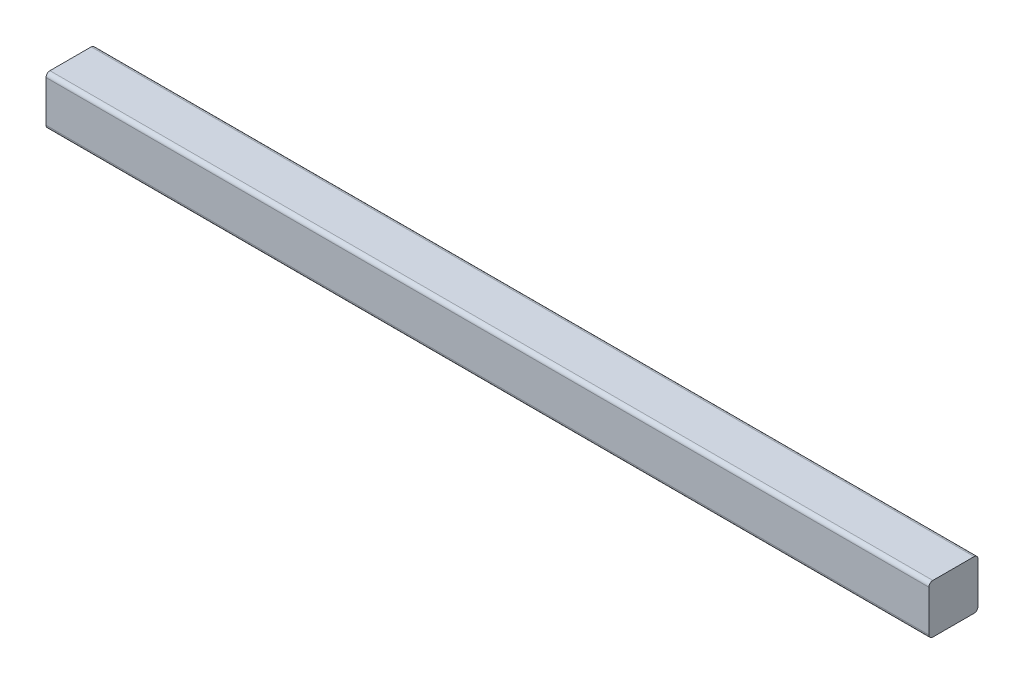
ISO-10303-21;
HEADER;
FILE_DESCRIPTION(('STEP AP214'),'2;1');
FILE_NAME('part.step','',(''),(''),'','','');
FILE_SCHEMA(('AUTOMOTIVE_DESIGN { 1 0 10303 214 1 1 1 1 }'));
ENDSEC;
DATA;
#1=APPLICATION_CONTEXT('core data for automotive mechanical design processes');
#2=APPLICATION_PROTOCOL_DEFINITION('international standard','automotive_design',2000,#1);
#3=PRODUCT_CONTEXT('',#1,'mechanical');
#4=PRODUCT('Part','Part','',(#3));
#5=PRODUCT_RELATED_PRODUCT_CATEGORY('part','',(#4));
#6=PRODUCT_DEFINITION_FORMATION('','',#4);
#7=PRODUCT_DEFINITION_CONTEXT('part definition',#1,'design');
#8=PRODUCT_DEFINITION('design','',#6,#7);
#9=PRODUCT_DEFINITION_SHAPE('','',#8);
#10=(LENGTH_UNIT() NAMED_UNIT(*) SI_UNIT(.MILLI.,.METRE.));
#11=(NAMED_UNIT(*) PLANE_ANGLE_UNIT() SI_UNIT($,.RADIAN.));
#12=(NAMED_UNIT(*) SI_UNIT($,.STERADIAN.) SOLID_ANGLE_UNIT());
#13=UNCERTAINTY_MEASURE_WITH_UNIT(LENGTH_MEASURE(1.E-05),#10,'distance_accuracy_value','');
#14=(GEOMETRIC_REPRESENTATION_CONTEXT(3) GLOBAL_UNCERTAINTY_ASSIGNED_CONTEXT((#13)) GLOBAL_UNIT_ASSIGNED_CONTEXT((#10,
#11,#12)) REPRESENTATION_CONTEXT('',''));
#15=CARTESIAN_POINT('',(0.,0.,0.));
#16=DIRECTION('',(0.,0.,1.));
#17=DIRECTION('',(1.,0.,0.));
#18=AXIS2_PLACEMENT_3D('',#15,#16,#17);
#19=CARTESIAN_POINT('',(45.4390093999929,-1.5875,1.5875));
#20=DIRECTION('',(-1.,0.,0.));
#21=DIRECTION('',(0.,0.,1.));
#22=AXIS2_PLACEMENT_3D('',#19,#20,#21);
#23=PLANE('',#22);
#24=DIRECTION('',(0.,0.,-1.));
#25=VECTOR('',#24,1.);
#26=CARTESIAN_POINT('',(45.4390093999929,-1.5875,1.5875));
#27=LINE('',#26,#25);
#28=CARTESIAN_POINT('',(45.4390093999929,-1.5875,1.3335));
#29=VERTEX_POINT('',#28);
#30=CARTESIAN_POINT('',(45.4390093999929,-1.5875,-1.3335));
#31=VERTEX_POINT('',#30);
#32=EDGE_CURVE('E106',#29,#31,#27,.T.);
#33=ORIENTED_EDGE('',*,*,#32,.T.);
#34=CARTESIAN_POINT('',(45.4390093999929,-1.3335,-1.3335));
#35=DIRECTION('',(-1.,0.,0.));
#36=DIRECTION('',(0.,0.,1.));
#37=AXIS2_PLACEMENT_3D('',#34,#35,#36);
#38=CIRCLE('',#37,0.254);
#39=CARTESIAN_POINT('',(45.4390093999929,-1.3335,-1.5875));
#40=VERTEX_POINT('',#39);
#41=EDGE_CURVE('E113',#31,#40,#38,.F.);
#42=ORIENTED_EDGE('',*,*,#41,.T.);
#43=DIRECTION('',(0.,1.,0.));
#44=VECTOR('',#43,1.);
#45=CARTESIAN_POINT('',(45.4390093999929,-1.5875,-1.5875));
#46=LINE('',#45,#44);
#47=CARTESIAN_POINT('',(45.4390093999929,1.3335,-1.5875));
#48=VERTEX_POINT('',#47);
#49=EDGE_CURVE('E173',#40,#48,#46,.T.);
#50=ORIENTED_EDGE('',*,*,#49,.T.);
#51=CARTESIAN_POINT('',(45.4390093999929,1.3335,-1.3335));
#52=DIRECTION('',(-1.,0.,0.));
#53=DIRECTION('',(0.,0.,1.));
#54=AXIS2_PLACEMENT_3D('',#51,#52,#53);
#55=CIRCLE('',#54,0.254);
#56=CARTESIAN_POINT('',(45.4390093999929,1.5875,-1.3335));
#57=VERTEX_POINT('',#56);
#58=EDGE_CURVE('E114',#48,#57,#55,.F.);
#59=ORIENTED_EDGE('',*,*,#58,.T.);
#60=DIRECTION('',(0.,0.,-1.));
#61=VECTOR('',#60,1.);
#62=CARTESIAN_POINT('',(45.4390093999929,1.5875,1.5875));
#63=LINE('',#62,#61);
#64=CARTESIAN_POINT('',(45.4390093999929,1.5875,1.3335));
#65=VERTEX_POINT('',#64);
#66=EDGE_CURVE('E130',#65,#57,#63,.T.);
#67=ORIENTED_EDGE('',*,*,#66,.F.);
#68=CARTESIAN_POINT('',(45.4390093999929,1.3335,1.3335));
#69=DIRECTION('',(-1.,0.,0.));
#70=DIRECTION('',(0.,0.,1.));
#71=AXIS2_PLACEMENT_3D('',#68,#69,#70);
#72=CIRCLE('',#71,0.254);
#73=CARTESIAN_POINT('',(45.4390093999929,1.3335,1.5875));
#74=VERTEX_POINT('',#73);
#75=EDGE_CURVE('E132',#65,#74,#72,.F.);
#76=ORIENTED_EDGE('',*,*,#75,.T.);
#77=DIRECTION('',(0.,1.,0.));
#78=VECTOR('',#77,1.);
#79=CARTESIAN_POINT('',(45.4390093999929,-1.5875,1.5875));
#80=LINE('',#79,#78);
#81=CARTESIAN_POINT('',(45.4390093999929,-1.3335,1.5875));
#82=VERTEX_POINT('',#81);
#83=EDGE_CURVE('E108',#82,#74,#80,.T.);
#84=ORIENTED_EDGE('',*,*,#83,.F.);
#85=CARTESIAN_POINT('',(45.4390093999929,-1.3335,1.3335));
#86=DIRECTION('',(-1.,0.,0.));
#87=DIRECTION('',(0.,0.,1.));
#88=AXIS2_PLACEMENT_3D('',#85,#86,#87);
#89=CIRCLE('',#88,0.254);
#90=EDGE_CURVE('E104',#82,#29,#89,.F.);
#91=ORIENTED_EDGE('',*,*,#90,.T.);
#92=EDGE_LOOP('',(#33,#42,#50,#59,#67,#76,#84,#91));
#93=FACE_BOUND('',#92,.T.);
#94=ADVANCED_FACE('F38',(#93),#23,.F.);
#95=CARTESIAN_POINT('',(-11.6529255319149,1.5875,1.5875));
#96=DIRECTION('',(0.,-1.,0.));
#97=DIRECTION('',(0.,0.,-1.));
#98=AXIS2_PLACEMENT_3D('',#95,#96,#97);
#99=PLANE('',#98);
#100=ORIENTED_EDGE('',*,*,#66,.T.);
#101=DIRECTION('',(-1.,0.,0.));
#102=VECTOR('',#101,1.);
#103=CARTESIAN_POINT('',(-11.6529255319149,1.5875,-1.3335));
#104=LINE('',#103,#102);
#105=CARTESIAN_POINT('',(-11.6529255319149,1.5875,-1.3335));
#106=VERTEX_POINT('',#105);
#107=EDGE_CURVE('E11',#57,#106,#104,.T.);
#108=ORIENTED_EDGE('',*,*,#107,.T.);
#109=DIRECTION('',(0.,0.,-1.));
#110=VECTOR('',#109,1.);
#111=CARTESIAN_POINT('',(-11.6529255319149,1.5875,1.5875));
#112=LINE('',#111,#110);
#113=CARTESIAN_POINT('',(-11.6529255319149,1.5875,1.3335));
#114=VERTEX_POINT('',#113);
#115=EDGE_CURVE('E135',#114,#106,#112,.T.);
#116=ORIENTED_EDGE('',*,*,#115,.F.);
#117=DIRECTION('',(-1.,0.,0.));
#118=VECTOR('',#117,1.);
#119=CARTESIAN_POINT('',(-11.6529255319149,1.5875,1.3335));
#120=LINE('',#119,#118);
#121=EDGE_CURVE('E46',#114,#65,#120,.F.);
#122=ORIENTED_EDGE('',*,*,#121,.T.);
#123=EDGE_LOOP('',(#100,#108,#116,#122));
#124=FACE_BOUND('',#123,.T.);
#125=ADVANCED_FACE('F158',(#124),#99,.F.);
#126=CARTESIAN_POINT('',(-11.6529255319149,-1.5875,1.5875));
#127=DIRECTION('',(1.,0.,0.));
#128=DIRECTION('',(0.,0.,-1.));
#129=AXIS2_PLACEMENT_3D('',#126,#127,#128);
#130=PLANE('',#129);
#131=DIRECTION('',(0.,-1.,0.));
#132=VECTOR('',#131,1.);
#133=CARTESIAN_POINT('',(-11.6529255319149,-1.5875,-1.5875));
#134=LINE('',#133,#132);
#135=CARTESIAN_POINT('',(-11.6529255319149,1.3335,-1.5875));
#136=VERTEX_POINT('',#135);
#137=CARTESIAN_POINT('',(-11.6529255319149,-1.3335,-1.5875));
#138=VERTEX_POINT('',#137);
#139=EDGE_CURVE('E170',#136,#138,#134,.T.);
#140=ORIENTED_EDGE('',*,*,#139,.T.);
#141=CARTESIAN_POINT('',(-11.6529255319149,-1.3335,-1.3335));
#142=DIRECTION('',(1.,0.,0.));
#143=DIRECTION('',(0.,0.,-1.));
#144=AXIS2_PLACEMENT_3D('',#141,#142,#143);
#145=CIRCLE('',#144,0.254);
#146=CARTESIAN_POINT('',(-11.6529255319149,-1.5875,-1.3335));
#147=VERTEX_POINT('',#146);
#148=EDGE_CURVE('E149',#138,#147,#145,.F.);
#149=ORIENTED_EDGE('',*,*,#148,.T.);
#150=DIRECTION('',(0.,0.,-1.));
#151=VECTOR('',#150,1.);
#152=CARTESIAN_POINT('',(-11.6529255319149,-1.5875,1.5875));
#153=LINE('',#152,#151);
#154=CARTESIAN_POINT('',(-11.6529255319149,-1.5875,1.3335));
#155=VERTEX_POINT('',#154);
#156=EDGE_CURVE('E124',#155,#147,#153,.T.);
#157=ORIENTED_EDGE('',*,*,#156,.F.);
#158=CARTESIAN_POINT('',(-11.6529255319149,-1.3335,1.3335));
#159=DIRECTION('',(1.,0.,0.));
#160=DIRECTION('',(0.,0.,-1.));
#161=AXIS2_PLACEMENT_3D('',#158,#159,#160);
#162=CIRCLE('',#161,0.254);
#163=CARTESIAN_POINT('',(-11.6529255319149,-1.3335,1.5875));
#164=VERTEX_POINT('',#163);
#165=EDGE_CURVE('E129',#155,#164,#162,.F.);
#166=ORIENTED_EDGE('',*,*,#165,.T.);
#167=DIRECTION('',(0.,-1.,0.));
#168=VECTOR('',#167,1.);
#169=CARTESIAN_POINT('',(-11.6529255319149,-1.5875,1.5875));
#170=LINE('',#169,#168);
#171=CARTESIAN_POINT('',(-11.6529255319149,1.3335,1.5875));
#172=VERTEX_POINT('',#171);
#173=EDGE_CURVE('E125',#172,#164,#170,.T.);
#174=ORIENTED_EDGE('',*,*,#173,.F.);
#175=CARTESIAN_POINT('',(-11.6529255319149,1.3335,1.3335));
#176=DIRECTION('',(1.,0.,0.));
#177=DIRECTION('',(0.,0.,-1.));
#178=AXIS2_PLACEMENT_3D('',#175,#176,#177);
#179=CIRCLE('',#178,0.254);
#180=EDGE_CURVE('E60',#172,#114,#179,.F.);
#181=ORIENTED_EDGE('',*,*,#180,.T.);
#182=ORIENTED_EDGE('',*,*,#115,.T.);
#183=CARTESIAN_POINT('',(-11.6529255319149,1.3335,-1.3335));
#184=DIRECTION('',(1.,0.,0.));
#185=DIRECTION('',(0.,0.,-1.));
#186=AXIS2_PLACEMENT_3D('',#183,#184,#185);
#187=CIRCLE('',#186,0.254);
#188=EDGE_CURVE('E53',#106,#136,#187,.F.);
#189=ORIENTED_EDGE('',*,*,#188,.T.);
#190=EDGE_LOOP('',(#140,#149,#157,#166,#174,#181,#182,#189));
#191=FACE_BOUND('',#190,.T.);
#192=ADVANCED_FACE('F168',(#191),#130,.F.);
#193=CARTESIAN_POINT('',(-11.6529255319149,-1.5875,1.5875));
#194=DIRECTION('',(0.,1.,0.));
#195=DIRECTION('',(0.,0.,1.));
#196=AXIS2_PLACEMENT_3D('',#193,#194,#195);
#197=PLANE('',#196);
#198=ORIENTED_EDGE('',*,*,#156,.T.);
#199=DIRECTION('',(1.,0.,0.));
#200=VECTOR('',#199,1.);
#201=CARTESIAN_POINT('',(45.4390093999929,-1.5875,-1.3335));
#202=LINE('',#201,#200);
#203=EDGE_CURVE('E123',#147,#31,#202,.T.);
#204=ORIENTED_EDGE('',*,*,#203,.T.);
#205=ORIENTED_EDGE('',*,*,#32,.F.);
#206=DIRECTION('',(1.,0.,0.));
#207=VECTOR('',#206,1.);
#208=CARTESIAN_POINT('',(-11.6529255319149,-1.5875,1.3335));
#209=LINE('',#208,#207);
#210=EDGE_CURVE('E120',#29,#155,#209,.F.);
#211=ORIENTED_EDGE('',*,*,#210,.T.);
#212=EDGE_LOOP('',(#198,#204,#205,#211));
#213=FACE_BOUND('',#212,.T.);
#214=ADVANCED_FACE('F119',(#213),#197,.F.);
#215=CARTESIAN_POINT('',(0.,0.,1.5875));
#216=DIRECTION('',(0.,0.,-1.));
#217=DIRECTION('',(-1.,0.,0.));
#218=AXIS2_PLACEMENT_3D('',#215,#216,#217);
#219=PLANE('',#218);
#220=ORIENTED_EDGE('',*,*,#173,.T.);
#221=DIRECTION('',(1.,0.,0.));
#222=VECTOR('',#221,1.);
#223=CARTESIAN_POINT('',(0.,-1.3335,1.5875));
#224=LINE('',#223,#222);
#225=EDGE_CURVE('E154',#164,#82,#224,.T.);
#226=ORIENTED_EDGE('',*,*,#225,.T.);
#227=ORIENTED_EDGE('',*,*,#83,.T.);
#228=DIRECTION('',(-1.,0.,0.));
#229=VECTOR('',#228,1.);
#230=CARTESIAN_POINT('',(0.,1.3335,1.5875));
#231=LINE('',#230,#229);
#232=EDGE_CURVE('E151',#74,#172,#231,.T.);
#233=ORIENTED_EDGE('',*,*,#232,.T.);
#234=EDGE_LOOP('',(#220,#226,#227,#233));
#235=FACE_BOUND('',#234,.T.);
#236=ADVANCED_FACE('F166',(#235),#219,.F.);
#237=CARTESIAN_POINT('',(0.,0.,-1.5875));
#238=DIRECTION('',(0.,0.,-1.));
#239=DIRECTION('',(-1.,0.,0.));
#240=AXIS2_PLACEMENT_3D('',#237,#238,#239);
#241=PLANE('',#240);
#242=ORIENTED_EDGE('',*,*,#49,.F.);
#243=DIRECTION('',(1.,0.,0.));
#244=VECTOR('',#243,1.);
#245=CARTESIAN_POINT('',(-11.6529255319149,-1.3335,-1.5875));
#246=LINE('',#245,#244);
#247=EDGE_CURVE('E144',#40,#138,#246,.F.);
#248=ORIENTED_EDGE('',*,*,#247,.T.);
#249=ORIENTED_EDGE('',*,*,#139,.F.);
#250=DIRECTION('',(-1.,0.,0.));
#251=VECTOR('',#250,1.);
#252=CARTESIAN_POINT('',(45.4390093999929,1.3335,-1.5875));
#253=LINE('',#252,#251);
#254=EDGE_CURVE('E142',#136,#48,#253,.F.);
#255=ORIENTED_EDGE('',*,*,#254,.T.);
#256=EDGE_LOOP('',(#242,#248,#249,#255));
#257=FACE_BOUND('',#256,.T.);
#258=ADVANCED_FACE('F180',(#257),#241,.T.);
#259=CARTESIAN_POINT('',(-11.6529255319149,-1.3335,-1.3335));
#260=DIRECTION('',(-1.,0.,0.));
#261=DIRECTION('',(0.,0.,1.));
#262=AXIS2_PLACEMENT_3D('',#259,#260,#261);
#263=CYLINDRICAL_SURFACE('',#262,0.254);
#264=ORIENTED_EDGE('',*,*,#148,.F.);
#265=ORIENTED_EDGE('',*,*,#247,.F.);
#266=ORIENTED_EDGE('',*,*,#41,.F.);
#267=ORIENTED_EDGE('',*,*,#203,.F.);
#268=EDGE_LOOP('',(#264,#265,#266,#267));
#269=FACE_BOUND('',#268,.T.);
#270=ADVANCED_FACE('F188',(#269),#263,.T.);
#271=CARTESIAN_POINT('',(0.,-1.3335,1.3335));
#272=DIRECTION('',(1.,0.,0.));
#273=DIRECTION('',(0.,0.,-1.));
#274=AXIS2_PLACEMENT_3D('',#271,#272,#273);
#275=CYLINDRICAL_SURFACE('',#274,0.254);
#276=ORIENTED_EDGE('',*,*,#165,.F.);
#277=ORIENTED_EDGE('',*,*,#210,.F.);
#278=ORIENTED_EDGE('',*,*,#90,.F.);
#279=ORIENTED_EDGE('',*,*,#225,.F.);
#280=EDGE_LOOP('',(#276,#277,#278,#279));
#281=FACE_BOUND('',#280,.T.);
#282=ADVANCED_FACE('F128',(#281),#275,.T.);
#283=CARTESIAN_POINT('',(-11.6529255319149,1.3335,-1.3335));
#284=DIRECTION('',(1.,0.,0.));
#285=DIRECTION('',(0.,0.,-1.));
#286=AXIS2_PLACEMENT_3D('',#283,#284,#285);
#287=CYLINDRICAL_SURFACE('',#286,0.254);
#288=ORIENTED_EDGE('',*,*,#58,.F.);
#289=ORIENTED_EDGE('',*,*,#254,.F.);
#290=ORIENTED_EDGE('',*,*,#188,.F.);
#291=ORIENTED_EDGE('',*,*,#107,.F.);
#292=EDGE_LOOP('',(#288,#289,#290,#291));
#293=FACE_BOUND('',#292,.T.);
#294=ADVANCED_FACE('F182',(#293),#287,.T.);
#295=CARTESIAN_POINT('',(0.,1.3335,1.3335));
#296=DIRECTION('',(-1.,0.,0.));
#297=DIRECTION('',(0.,0.,1.));
#298=AXIS2_PLACEMENT_3D('',#295,#296,#297);
#299=CYLINDRICAL_SURFACE('',#298,0.254);
#300=ORIENTED_EDGE('',*,*,#75,.F.);
#301=ORIENTED_EDGE('',*,*,#121,.F.);
#302=ORIENTED_EDGE('',*,*,#180,.F.);
#303=ORIENTED_EDGE('',*,*,#232,.F.);
#304=EDGE_LOOP('',(#300,#301,#302,#303));
#305=FACE_BOUND('',#304,.T.);
#306=ADVANCED_FACE('F40',(#305),#299,.T.);
#307=CLOSED_SHELL('',(#94,#125,#192,#214,#236,#258,#270,#282,#294,#306));
#308=MANIFOLD_SOLID_BREP('B2',#307);
#309=ADVANCED_BREP_SHAPE_REPRESENTATION('',(#18,#308),#14);
#310=SHAPE_DEFINITION_REPRESENTATION(#9,#309);
ENDSEC;
END-ISO-10303-21;
